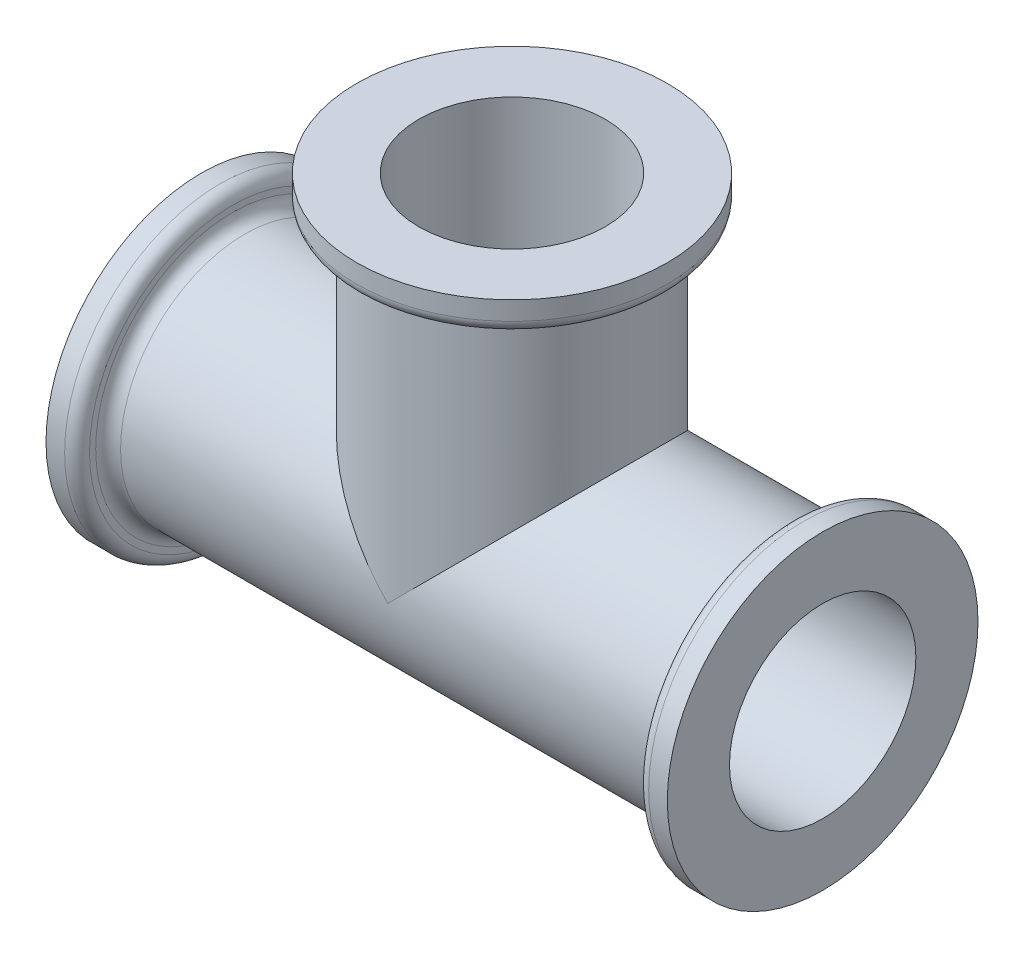
ISO-10303-21;
HEADER;
FILE_DESCRIPTION(('STEP AP214'),'2;1');
FILE_NAME('part.step','',(''),(''),'','','');
FILE_SCHEMA(('AUTOMOTIVE_DESIGN { 1 0 10303 214 1 1 1 1 }'));
ENDSEC;
DATA;
#1=APPLICATION_CONTEXT('core data for automotive mechanical design processes');
#2=APPLICATION_PROTOCOL_DEFINITION('international standard','automotive_design',2000,#1);
#3=PRODUCT_CONTEXT('',#1,'mechanical');
#4=PRODUCT('Part','Part','',(#3));
#5=PRODUCT_RELATED_PRODUCT_CATEGORY('part','',(#4));
#6=PRODUCT_DEFINITION_FORMATION('','',#4);
#7=PRODUCT_DEFINITION_CONTEXT('part definition',#1,'design');
#8=PRODUCT_DEFINITION('design','',#6,#7);
#9=PRODUCT_DEFINITION_SHAPE('','',#8);
#10=(LENGTH_UNIT() NAMED_UNIT(*) SI_UNIT(.MILLI.,.METRE.));
#11=(NAMED_UNIT(*) PLANE_ANGLE_UNIT() SI_UNIT($,.RADIAN.));
#12=(NAMED_UNIT(*) SI_UNIT($,.STERADIAN.) SOLID_ANGLE_UNIT());
#13=UNCERTAINTY_MEASURE_WITH_UNIT(LENGTH_MEASURE(1.E-05),#10,'distance_accuracy_value','');
#14=(GEOMETRIC_REPRESENTATION_CONTEXT(3) GLOBAL_UNCERTAINTY_ASSIGNED_CONTEXT((#13)) GLOBAL_UNIT_ASSIGNED_CONTEXT((#10,
#11,#12)) REPRESENTATION_CONTEXT('',''));
#15=CARTESIAN_POINT('',(0.,0.,0.));
#16=DIRECTION('',(0.,0.,1.));
#17=DIRECTION('',(1.,0.,0.));
#18=AXIS2_PLACEMENT_3D('',#15,#16,#17);
#19=CARTESIAN_POINT('',(0.,-12.502,0.));
#20=DIRECTION('',(0.,1.,0.));
#21=DIRECTION('',(0.,0.,1.));
#22=AXIS2_PLACEMENT_3D('',#19,#20,#21);
#23=CYLINDRICAL_SURFACE('',#22,10.);
#24=CARTESIAN_POINT('',(0.,21.5,0.));
#25=DIRECTION('',(0.,1.,0.));
#26=DIRECTION('',(0.,0.,1.));
#27=AXIS2_PLACEMENT_3D('',#24,#25,#26);
#28=CIRCLE('',#27,10.);
#29=CARTESIAN_POINT('',(0.,21.5,10.));
#30=VERTEX_POINT('',#29);
#31=EDGE_CURVE('E111',#30,#30,#28,.F.);
#32=ORIENTED_EDGE('',*,*,#31,.T.);
#33=EDGE_LOOP('',(#32));
#34=FACE_BOUND('',#33,.T.);
#35=CARTESIAN_POINT('',(0.,0.,0.));
#36=DIRECTION('',(0.707106781186547,0.707106781186547,0.));
#37=DIRECTION('',(-0.707106781186547,0.707106781186547,0.));
#38=AXIS2_PLACEMENT_3D('',#35,#36,#37);
#39=ELLIPSE('',#38,14.1421356237309,10.);
#40=CARTESIAN_POINT('',(0.,0.,-10.));
#41=VERTEX_POINT('',#40);
#42=CARTESIAN_POINT('',(0.,0.,10.));
#43=VERTEX_POINT('',#42);
#44=EDGE_CURVE('E85',#41,#43,#39,.T.);
#45=ORIENTED_EDGE('',*,*,#44,.T.);
#46=CARTESIAN_POINT('',(0.,0.,0.));
#47=DIRECTION('',(-0.707106781186547,0.707106781186547,0.));
#48=DIRECTION('',(0.707106781186547,0.707106781186547,0.));
#49=AXIS2_PLACEMENT_3D('',#46,#47,#48);
#50=ELLIPSE('',#49,14.1421356237309,10.);
#51=EDGE_CURVE('E67',#43,#41,#50,.T.);
#52=ORIENTED_EDGE('',*,*,#51,.T.);
#53=EDGE_LOOP('',(#45,#52));
#54=FACE_BOUND('',#53,.T.);
#55=ADVANCED_FACE('F45',(#34,#54),#23,.T.);
#56=CARTESIAN_POINT('',(0.,0.,0.));
#57=DIRECTION('',(-1.,0.,0.));
#58=DIRECTION('',(0.,0.,1.));
#59=AXIS2_PLACEMENT_3D('',#56,#57,#58);
#60=CYLINDRICAL_SURFACE('',#59,7.50000000000001);
#61=CARTESIAN_POINT('',(0.,0.,0.));
#62=DIRECTION('',(0.707106781186547,0.707106781186547,0.));
#63=DIRECTION('',(-0.707106781186547,0.707106781186547,0.));
#64=AXIS2_PLACEMENT_3D('',#61,#62,#63);
#65=ELLIPSE('',#64,10.6066017177982,7.5);
#66=CARTESIAN_POINT('',(0.,0.,7.5));
#67=VERTEX_POINT('',#66);
#68=CARTESIAN_POINT('',(0.,0.,-7.5));
#69=VERTEX_POINT('',#68);
#70=EDGE_CURVE('E72',#67,#69,#65,.F.);
#71=ORIENTED_EDGE('',*,*,#70,.F.);
#72=CARTESIAN_POINT('',(0.,0.,0.));
#73=DIRECTION('',(-0.707106781186547,0.707106781186547,0.));
#74=DIRECTION('',(0.707106781186547,0.707106781186547,0.));
#75=AXIS2_PLACEMENT_3D('',#72,#73,#74);
#76=ELLIPSE('',#75,10.6066017177982,7.5);
#77=EDGE_CURVE('E60',#69,#67,#76,.F.);
#78=ORIENTED_EDGE('',*,*,#77,.F.);
#79=EDGE_LOOP('',(#71,#78));
#80=FACE_BOUND('',#79,.T.);
#81=CARTESIAN_POINT('',(25.,0.,0.));
#82=DIRECTION('',(-1.,0.,0.));
#83=DIRECTION('',(0.,0.,1.));
#84=AXIS2_PLACEMENT_3D('',#81,#82,#83);
#85=CIRCLE('',#84,7.50000000000001);
#86=CARTESIAN_POINT('',(25.,0.,7.50000000000001));
#87=VERTEX_POINT('',#86);
#88=EDGE_CURVE('E95',#87,#87,#85,.T.);
#89=ORIENTED_EDGE('',*,*,#88,.F.);
#90=EDGE_LOOP('',(#89));
#91=FACE_BOUND('',#90,.T.);
#92=CARTESIAN_POINT('',(-25.,0.,0.));
#93=DIRECTION('',(-1.,0.,0.));
#94=DIRECTION('',(0.,0.,1.));
#95=AXIS2_PLACEMENT_3D('',#92,#93,#94);
#96=CIRCLE('',#95,7.50000000000001);
#97=CARTESIAN_POINT('',(-25.,0.,7.50000000000001));
#98=VERTEX_POINT('',#97);
#99=EDGE_CURVE('E107',#98,#98,#96,.T.);
#100=ORIENTED_EDGE('',*,*,#99,.T.);
#101=EDGE_LOOP('',(#100));
#102=FACE_BOUND('',#101,.T.);
#103=ADVANCED_FACE('F78',(#80,#91,#102),#60,.F.);
#104=CARTESIAN_POINT('',(-25.,7.50000000000001,0.));
#105=DIRECTION('',(1.,0.,0.));
#106=DIRECTION('',(0.,0.,-1.));
#107=AXIS2_PLACEMENT_3D('',#104,#105,#106);
#108=PLANE('',#107);
#109=ORIENTED_EDGE('',*,*,#99,.F.);
#110=EDGE_LOOP('',(#109));
#111=FACE_BOUND('',#110,.T.);
#112=CARTESIAN_POINT('',(-25.,0.,0.));
#113=DIRECTION('',(-1.,0.,0.));
#114=DIRECTION('',(0.,0.,1.));
#115=AXIS2_PLACEMENT_3D('',#112,#113,#114);
#116=CIRCLE('',#115,12.5);
#117=CARTESIAN_POINT('',(-25.,0.,12.5));
#118=VERTEX_POINT('',#117);
#119=EDGE_CURVE('E103',#118,#118,#116,.T.);
#120=ORIENTED_EDGE('',*,*,#119,.T.);
#121=EDGE_LOOP('',(#120));
#122=FACE_BOUND('',#121,.T.);
#123=ADVANCED_FACE('F174',(#111,#122),#108,.F.);
#124=CARTESIAN_POINT('',(0.,0.,0.));
#125=DIRECTION('',(-1.,0.,0.));
#126=DIRECTION('',(0.,0.,1.));
#127=AXIS2_PLACEMENT_3D('',#124,#125,#126);
#128=CYLINDRICAL_SURFACE('',#127,12.5);
#129=CARTESIAN_POINT('',(-23.5,0.,0.));
#130=DIRECTION('',(-1.,0.,0.));
#131=DIRECTION('',(0.,0.,1.));
#132=AXIS2_PLACEMENT_3D('',#129,#130,#131);
#133=CIRCLE('',#132,12.5);
#134=CARTESIAN_POINT('',(-23.5,0.,12.5));
#135=VERTEX_POINT('',#134);
#136=EDGE_CURVE('E54',#135,#135,#133,.T.);
#137=ORIENTED_EDGE('',*,*,#136,.T.);
#138=EDGE_LOOP('',(#137));
#139=FACE_BOUND('',#138,.T.);
#140=ORIENTED_EDGE('',*,*,#119,.F.);
#141=EDGE_LOOP('',(#140));
#142=FACE_BOUND('',#141,.T.);
#143=ADVANCED_FACE('F154',(#139,#142),#128,.T.);
#144=CARTESIAN_POINT('',(-22.5,12.5,0.));
#145=DIRECTION('',(-1.,0.,0.));
#146=DIRECTION('',(0.,0.,1.));
#147=AXIS2_PLACEMENT_3D('',#144,#145,#146);
#148=PLANE('',#147);
#149=CARTESIAN_POINT('',(-22.5,0.,0.));
#150=DIRECTION('',(-1.,0.,0.));
#151=DIRECTION('',(0.,0.,1.));
#152=AXIS2_PLACEMENT_3D('',#149,#150,#151);
#153=CIRCLE('',#152,11.5);
#154=CARTESIAN_POINT('',(-22.5,0.,11.5));
#155=VERTEX_POINT('',#154);
#156=EDGE_CURVE('E11',#155,#155,#153,.F.);
#157=ORIENTED_EDGE('',*,*,#156,.T.);
#158=EDGE_LOOP('',(#157));
#159=FACE_BOUND('',#158,.T.);
#160=CARTESIAN_POINT('',(-22.5,0.,0.));
#161=DIRECTION('',(-1.,0.,0.));
#162=DIRECTION('',(0.,0.,1.));
#163=AXIS2_PLACEMENT_3D('',#160,#161,#162);
#164=CIRCLE('',#163,11.);
#165=CARTESIAN_POINT('',(-22.5,0.,11.));
#166=VERTEX_POINT('',#165);
#167=EDGE_CURVE('E131',#166,#166,#164,.T.);
#168=ORIENTED_EDGE('',*,*,#167,.T.);
#169=EDGE_LOOP('',(#168));
#170=FACE_BOUND('',#169,.T.);
#171=ADVANCED_FACE('F195',(#159,#170),#148,.F.);
#172=CARTESIAN_POINT('',(0.,0.,0.));
#173=DIRECTION('',(-1.,0.,0.));
#174=DIRECTION('',(0.,0.,1.));
#175=AXIS2_PLACEMENT_3D('',#172,#173,#174);
#176=CYLINDRICAL_SURFACE('',#175,10.);
#177=CARTESIAN_POINT('',(21.5,0.,0.));
#178=DIRECTION('',(1.,0.,0.));
#179=DIRECTION('',(0.,0.,-1.));
#180=AXIS2_PLACEMENT_3D('',#177,#178,#179);
#181=CIRCLE('',#180,10.);
#182=CARTESIAN_POINT('',(21.5,0.,-10.));
#183=VERTEX_POINT('',#182);
#184=EDGE_CURVE('E123',#183,#183,#181,.F.);
#185=ORIENTED_EDGE('',*,*,#184,.T.);
#186=EDGE_LOOP('',(#185));
#187=FACE_BOUND('',#186,.T.);
#188=CARTESIAN_POINT('',(-21.5,0.,0.));
#189=DIRECTION('',(-1.,0.,0.));
#190=DIRECTION('',(0.,0.,1.));
#191=AXIS2_PLACEMENT_3D('',#188,#189,#190);
#192=CIRCLE('',#191,10.);
#193=CARTESIAN_POINT('',(-21.5,0.,10.));
#194=VERTEX_POINT('',#193);
#195=EDGE_CURVE('E119',#194,#194,#192,.F.);
#196=ORIENTED_EDGE('',*,*,#195,.T.);
#197=EDGE_LOOP('',(#196));
#198=FACE_BOUND('',#197,.T.);
#199=ORIENTED_EDGE('',*,*,#44,.F.);
#200=ORIENTED_EDGE('',*,*,#51,.F.);
#201=EDGE_LOOP('',(#199,#200));
#202=FACE_BOUND('',#201,.T.);
#203=ADVANCED_FACE('F192',(#187,#198,#202),#176,.T.);
#204=CARTESIAN_POINT('',(22.5,12.5,0.));
#205=DIRECTION('',(1.,0.,0.));
#206=DIRECTION('',(0.,0.,-1.));
#207=AXIS2_PLACEMENT_3D('',#204,#205,#206);
#208=PLANE('',#207);
#209=CARTESIAN_POINT('',(22.5,0.,0.));
#210=DIRECTION('',(1.,0.,0.));
#211=DIRECTION('',(0.,0.,-1.));
#212=AXIS2_PLACEMENT_3D('',#209,#210,#211);
#213=CIRCLE('',#212,11.5);
#214=CARTESIAN_POINT('',(22.5,0.,-11.5));
#215=VERTEX_POINT('',#214);
#216=EDGE_CURVE('E143',#215,#215,#213,.F.);
#217=ORIENTED_EDGE('',*,*,#216,.T.);
#218=EDGE_LOOP('',(#217));
#219=FACE_BOUND('',#218,.T.);
#220=CARTESIAN_POINT('',(22.5,0.,0.));
#221=DIRECTION('',(1.,0.,0.));
#222=DIRECTION('',(0.,0.,-1.));
#223=AXIS2_PLACEMENT_3D('',#220,#221,#222);
#224=CIRCLE('',#223,11.);
#225=CARTESIAN_POINT('',(22.5,0.,-11.));
#226=VERTEX_POINT('',#225);
#227=EDGE_CURVE('E127',#226,#226,#224,.T.);
#228=ORIENTED_EDGE('',*,*,#227,.T.);
#229=EDGE_LOOP('',(#228));
#230=FACE_BOUND('',#229,.T.);
#231=ADVANCED_FACE('F188',(#219,#230),#208,.F.);
#232=CARTESIAN_POINT('',(0.,0.,0.));
#233=DIRECTION('',(-1.,0.,0.));
#234=DIRECTION('',(0.,0.,1.));
#235=AXIS2_PLACEMENT_3D('',#232,#233,#234);
#236=CYLINDRICAL_SURFACE('',#235,12.5);
#237=CARTESIAN_POINT('',(23.5,0.,0.));
#238=DIRECTION('',(1.,0.,0.));
#239=DIRECTION('',(0.,0.,-1.));
#240=AXIS2_PLACEMENT_3D('',#237,#238,#239);
#241=CIRCLE('',#240,12.5);
#242=CARTESIAN_POINT('',(23.5,0.,-12.5));
#243=VERTEX_POINT('',#242);
#244=EDGE_CURVE('E147',#243,#243,#241,.T.);
#245=ORIENTED_EDGE('',*,*,#244,.T.);
#246=EDGE_LOOP('',(#245));
#247=FACE_BOUND('',#246,.T.);
#248=CARTESIAN_POINT('',(25.,0.,0.));
#249=DIRECTION('',(-1.,0.,0.));
#250=DIRECTION('',(0.,0.,1.));
#251=AXIS2_PLACEMENT_3D('',#248,#249,#250);
#252=CIRCLE('',#251,12.5);
#253=CARTESIAN_POINT('',(25.,0.,12.5));
#254=VERTEX_POINT('',#253);
#255=EDGE_CURVE('E99',#254,#254,#252,.T.);
#256=ORIENTED_EDGE('',*,*,#255,.T.);
#257=EDGE_LOOP('',(#256));
#258=FACE_BOUND('',#257,.T.);
#259=ADVANCED_FACE('F184',(#247,#258),#236,.T.);
#260=CARTESIAN_POINT('',(25.,7.50000000000001,0.));
#261=DIRECTION('',(-1.,0.,0.));
#262=DIRECTION('',(0.,0.,1.));
#263=AXIS2_PLACEMENT_3D('',#260,#261,#262);
#264=PLANE('',#263);
#265=ORIENTED_EDGE('',*,*,#255,.F.);
#266=EDGE_LOOP('',(#265));
#267=FACE_BOUND('',#266,.T.);
#268=ORIENTED_EDGE('',*,*,#88,.T.);
#269=EDGE_LOOP('',(#268));
#270=FACE_BOUND('',#269,.T.);
#271=ADVANCED_FACE('F180',(#267,#270),#264,.F.);
#272=CARTESIAN_POINT('',(0.,22.5,0.));
#273=DIRECTION('',(0.,1.,0.));
#274=DIRECTION('',(0.,0.,1.));
#275=AXIS2_PLACEMENT_3D('',#272,#273,#274);
#276=CYLINDRICAL_SURFACE('',#275,12.5);
#277=CARTESIAN_POINT('',(0.,23.5,0.));
#278=DIRECTION('',(0.,1.,0.));
#279=DIRECTION('',(0.,0.,1.));
#280=AXIS2_PLACEMENT_3D('',#277,#278,#279);
#281=CIRCLE('',#280,12.5);
#282=CARTESIAN_POINT('',(0.,23.5,12.5));
#283=VERTEX_POINT('',#282);
#284=EDGE_CURVE('E135',#283,#283,#281,.T.);
#285=ORIENTED_EDGE('',*,*,#284,.T.);
#286=EDGE_LOOP('',(#285));
#287=FACE_BOUND('',#286,.T.);
#288=CARTESIAN_POINT('',(0.,25.,0.));
#289=DIRECTION('',(0.,1.,0.));
#290=DIRECTION('',(0.,0.,1.));
#291=AXIS2_PLACEMENT_3D('',#288,#289,#290);
#292=CIRCLE('',#291,12.5);
#293=CARTESIAN_POINT('',(0.,25.,12.5));
#294=VERTEX_POINT('',#293);
#295=EDGE_CURVE('E81',#294,#294,#292,.T.);
#296=ORIENTED_EDGE('',*,*,#295,.F.);
#297=EDGE_LOOP('',(#296));
#298=FACE_BOUND('',#297,.T.);
#299=ADVANCED_FACE('F183',(#287,#298),#276,.T.);
#300=CARTESIAN_POINT('',(0.,22.5,0.));
#301=DIRECTION('',(0.,1.,0.));
#302=DIRECTION('',(0.,0.,1.));
#303=AXIS2_PLACEMENT_3D('',#300,#301,#302);
#304=PLANE('',#303);
#305=CARTESIAN_POINT('',(0.,22.5,0.));
#306=DIRECTION('',(0.,1.,0.));
#307=DIRECTION('',(0.,0.,1.));
#308=AXIS2_PLACEMENT_3D('',#305,#306,#307);
#309=CIRCLE('',#308,11.5);
#310=CARTESIAN_POINT('',(0.,22.5,11.5));
#311=VERTEX_POINT('',#310);
#312=EDGE_CURVE('E139',#311,#311,#309,.F.);
#313=ORIENTED_EDGE('',*,*,#312,.T.);
#314=EDGE_LOOP('',(#313));
#315=FACE_BOUND('',#314,.T.);
#316=CARTESIAN_POINT('',(0.,22.5,0.));
#317=DIRECTION('',(0.,1.,0.));
#318=DIRECTION('',(0.,0.,1.));
#319=AXIS2_PLACEMENT_3D('',#316,#317,#318);
#320=CIRCLE('',#319,11.);
#321=CARTESIAN_POINT('',(0.,22.5,11.));
#322=VERTEX_POINT('',#321);
#323=EDGE_CURVE('E115',#322,#322,#320,.T.);
#324=ORIENTED_EDGE('',*,*,#323,.T.);
#325=EDGE_LOOP('',(#324));
#326=FACE_BOUND('',#325,.T.);
#327=ADVANCED_FACE('F228',(#315,#326),#304,.F.);
#328=CARTESIAN_POINT('',(0.,25.,0.));
#329=DIRECTION('',(0.,1.,0.));
#330=DIRECTION('',(0.,0.,1.));
#331=AXIS2_PLACEMENT_3D('',#328,#329,#330);
#332=PLANE('',#331);
#333=CARTESIAN_POINT('',(0.,25.,0.));
#334=DIRECTION('',(0.,1.,0.));
#335=DIRECTION('',(0.,0.,1.));
#336=AXIS2_PLACEMENT_3D('',#333,#334,#335);
#337=CIRCLE('',#336,7.5);
#338=CARTESIAN_POINT('',(0.,25.,7.5));
#339=VERTEX_POINT('',#338);
#340=EDGE_CURVE('E76',#339,#339,#337,.T.);
#341=ORIENTED_EDGE('',*,*,#340,.F.);
#342=EDGE_LOOP('',(#341));
#343=FACE_BOUND('',#342,.T.);
#344=ORIENTED_EDGE('',*,*,#295,.T.);
#345=EDGE_LOOP('',(#344));
#346=FACE_BOUND('',#345,.T.);
#347=ADVANCED_FACE('F178',(#343,#346),#332,.T.);
#348=CARTESIAN_POINT('',(0.,-12.501,0.));
#349=DIRECTION('',(0.,1.,0.));
#350=DIRECTION('',(0.,0.,1.));
#351=AXIS2_PLACEMENT_3D('',#348,#349,#350);
#352=CYLINDRICAL_SURFACE('',#351,7.5);
#353=ORIENTED_EDGE('',*,*,#340,.T.);
#354=EDGE_LOOP('',(#353));
#355=FACE_BOUND('',#354,.T.);
#356=ORIENTED_EDGE('',*,*,#77,.T.);
#357=ORIENTED_EDGE('',*,*,#70,.T.);
#358=EDGE_LOOP('',(#356,#357));
#359=FACE_BOUND('',#358,.T.);
#360=ADVANCED_FACE('F73',(#355,#359),#352,.F.);
#361=CARTESIAN_POINT('',(0.,21.5,0.));
#362=DIRECTION('',(0.,1.,0.));
#363=DIRECTION('',(0.,0.,1.));
#364=AXIS2_PLACEMENT_3D('',#361,#362,#363);
#365=TOROIDAL_SURFACE('',#364,11.,1.);
#366=ORIENTED_EDGE('',*,*,#323,.F.);
#367=EDGE_LOOP('',(#366));
#368=FACE_BOUND('',#367,.T.);
#369=ORIENTED_EDGE('',*,*,#31,.F.);
#370=EDGE_LOOP('',(#369));
#371=FACE_BOUND('',#370,.T.);
#372=ADVANCED_FACE('F205',(#368,#371),#365,.F.);
#373=CARTESIAN_POINT('',(21.5,0.,0.));
#374=DIRECTION('',(1.,0.,0.));
#375=DIRECTION('',(0.,0.,-1.));
#376=AXIS2_PLACEMENT_3D('',#373,#374,#375);
#377=TOROIDAL_SURFACE('',#376,11.,1.);
#378=ORIENTED_EDGE('',*,*,#227,.F.);
#379=EDGE_LOOP('',(#378));
#380=FACE_BOUND('',#379,.T.);
#381=ORIENTED_EDGE('',*,*,#184,.F.);
#382=EDGE_LOOP('',(#381));
#383=FACE_BOUND('',#382,.T.);
#384=ADVANCED_FACE('F208',(#380,#383),#377,.F.);
#385=CARTESIAN_POINT('',(-21.5,0.,0.));
#386=DIRECTION('',(-1.,0.,0.));
#387=DIRECTION('',(0.,0.,1.));
#388=AXIS2_PLACEMENT_3D('',#385,#386,#387);
#389=TOROIDAL_SURFACE('',#388,11.,1.);
#390=ORIENTED_EDGE('',*,*,#195,.F.);
#391=EDGE_LOOP('',(#390));
#392=FACE_BOUND('',#391,.T.);
#393=ORIENTED_EDGE('',*,*,#167,.F.);
#394=EDGE_LOOP('',(#393));
#395=FACE_BOUND('',#394,.T.);
#396=ADVANCED_FACE('F212',(#392,#395),#389,.F.);
#397=CARTESIAN_POINT('',(0.,23.5,0.));
#398=DIRECTION('',(0.,1.,0.));
#399=DIRECTION('',(0.,0.,1.));
#400=AXIS2_PLACEMENT_3D('',#397,#398,#399);
#401=TOROIDAL_SURFACE('',#400,11.5,1.);
#402=ORIENTED_EDGE('',*,*,#312,.F.);
#403=EDGE_LOOP('',(#402));
#404=FACE_BOUND('',#403,.T.);
#405=ORIENTED_EDGE('',*,*,#284,.F.);
#406=EDGE_LOOP('',(#405));
#407=FACE_BOUND('',#406,.T.);
#408=ADVANCED_FACE('F163',(#404,#407),#401,.T.);
#409=CARTESIAN_POINT('',(23.5,0.,0.));
#410=DIRECTION('',(1.,0.,0.));
#411=DIRECTION('',(0.,0.,-1.));
#412=AXIS2_PLACEMENT_3D('',#409,#410,#411);
#413=TOROIDAL_SURFACE('',#412,11.5,1.);
#414=ORIENTED_EDGE('',*,*,#244,.F.);
#415=EDGE_LOOP('',(#414));
#416=FACE_BOUND('',#415,.T.);
#417=ORIENTED_EDGE('',*,*,#216,.F.);
#418=EDGE_LOOP('',(#417));
#419=FACE_BOUND('',#418,.T.);
#420=ADVANCED_FACE('F158',(#416,#419),#413,.T.);
#421=CARTESIAN_POINT('',(-23.5,0.,0.));
#422=DIRECTION('',(-1.,0.,0.));
#423=DIRECTION('',(0.,0.,1.));
#424=AXIS2_PLACEMENT_3D('',#421,#422,#423);
#425=TOROIDAL_SURFACE('',#424,11.5,1.);
#426=ORIENTED_EDGE('',*,*,#156,.F.);
#427=EDGE_LOOP('',(#426));
#428=FACE_BOUND('',#427,.T.);
#429=ORIENTED_EDGE('',*,*,#136,.F.);
#430=EDGE_LOOP('',(#429));
#431=FACE_BOUND('',#430,.T.);
#432=ADVANCED_FACE('F47',(#428,#431),#425,.T.);
#433=CLOSED_SHELL('',(#55,#103,#123,#143,#171,#203,#231,#259,#271,#299,#327,#347,#360,#372,#384,
#396,#408,#420,#432));
#434=MANIFOLD_SOLID_BREP('B2',#433);
#435=ADVANCED_BREP_SHAPE_REPRESENTATION('',(#18,#434),#14);
#436=SHAPE_DEFINITION_REPRESENTATION(#9,#435);
ENDSEC;
END-ISO-10303-21;
